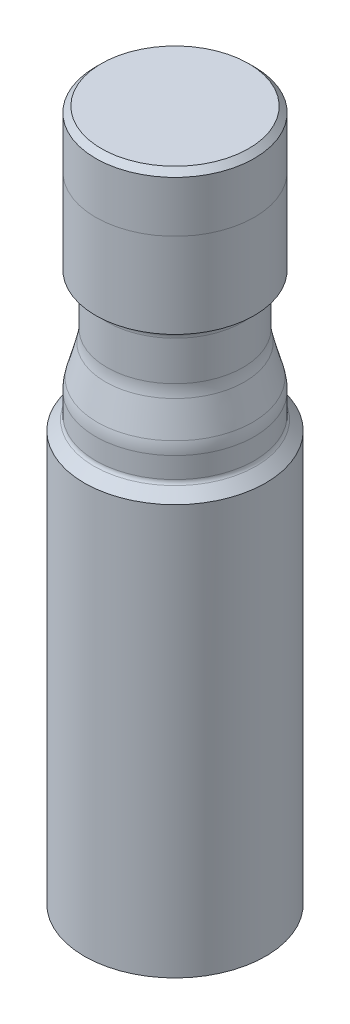
ISO-10303-21;
HEADER;
FILE_DESCRIPTION(('STEP AP214'),'2;1');
FILE_NAME('part.step','',(''),(''),'','','');
FILE_SCHEMA(('AUTOMOTIVE_DESIGN { 1 0 10303 214 1 1 1 1 }'));
ENDSEC;
DATA;
#1=APPLICATION_CONTEXT('core data for automotive mechanical design processes');
#2=APPLICATION_PROTOCOL_DEFINITION('international standard','automotive_design',2000,#1);
#3=PRODUCT_CONTEXT('',#1,'mechanical');
#4=PRODUCT('Part','Part','',(#3));
#5=PRODUCT_RELATED_PRODUCT_CATEGORY('part','',(#4));
#6=PRODUCT_DEFINITION_FORMATION('','',#4);
#7=PRODUCT_DEFINITION_CONTEXT('part definition',#1,'design');
#8=PRODUCT_DEFINITION('design','',#6,#7);
#9=PRODUCT_DEFINITION_SHAPE('','',#8);
#10=(LENGTH_UNIT() NAMED_UNIT(*) SI_UNIT(.MILLI.,.METRE.));
#11=(NAMED_UNIT(*) PLANE_ANGLE_UNIT() SI_UNIT($,.RADIAN.));
#12=(NAMED_UNIT(*) SI_UNIT($,.STERADIAN.) SOLID_ANGLE_UNIT());
#13=UNCERTAINTY_MEASURE_WITH_UNIT(LENGTH_MEASURE(1.E-05),#10,'distance_accuracy_value','');
#14=(GEOMETRIC_REPRESENTATION_CONTEXT(3) GLOBAL_UNCERTAINTY_ASSIGNED_CONTEXT((#13)) GLOBAL_UNIT_ASSIGNED_CONTEXT((#10,
#11,#12)) REPRESENTATION_CONTEXT('',''));
#15=CARTESIAN_POINT('',(0.,0.,0.));
#16=DIRECTION('',(0.,0.,1.));
#17=DIRECTION('',(1.,0.,0.));
#18=AXIS2_PLACEMENT_3D('',#15,#16,#17);
#19=CARTESIAN_POINT('',(180.,669.608554244279,0.));
#20=DIRECTION('',(0.,1.,0.));
#21=DIRECTION('',(0.,0.,1.));
#22=AXIS2_PLACEMENT_3D('',#19,#20,#21);
#23=CYLINDRICAL_SURFACE('',#22,70.);
#24=CARTESIAN_POINT('',(180.,544.608554244279,0.));
#25=DIRECTION('',(0.,1.,0.));
#26=DIRECTION('',(0.,0.,1.));
#27=AXIS2_PLACEMENT_3D('',#24,#25,#26);
#28=CIRCLE('',#27,70.);
#29=CARTESIAN_POINT('',(180.,544.608554244279,70.));
#30=VERTEX_POINT('',#29);
#31=EDGE_CURVE('E87',#30,#30,#28,.T.);
#32=ORIENTED_EDGE('',*,*,#31,.T.);
#33=EDGE_LOOP('',(#32));
#34=FACE_BOUND('',#33,.T.);
#35=CARTESIAN_POINT('',(180.,619.608554244279,0.));
#36=DIRECTION('',(0.,1.,0.));
#37=DIRECTION('',(0.,0.,1.));
#38=AXIS2_PLACEMENT_3D('',#35,#36,#37);
#39=CIRCLE('',#38,70.);
#40=CARTESIAN_POINT('',(180.,619.608554244279,70.));
#41=VERTEX_POINT('',#40);
#42=EDGE_CURVE('E10',#41,#41,#39,.T.);
#43=ORIENTED_EDGE('',*,*,#42,.F.);
#44=EDGE_LOOP('',(#43));
#45=FACE_BOUND('',#44,.T.);
#46=ADVANCED_FACE('F40',(#34,#45),#23,.T.);
#47=CARTESIAN_POINT('',(180.,60.,0.));
#48=DIRECTION('',(0.,1.,0.));
#49=DIRECTION('',(0.,0.,1.));
#50=AXIS2_PLACEMENT_3D('',#47,#48,#49);
#51=PLANE('',#50);
#52=CARTESIAN_POINT('',(180.,59.9999999999999,0.));
#53=DIRECTION('',(0.,1.,0.));
#54=DIRECTION('',(0.,0.,1.));
#55=AXIS2_PLACEMENT_3D('',#52,#53,#54);
#56=CIRCLE('',#55,80.);
#57=CARTESIAN_POINT('',(180.,59.9999999999999,80.));
#58=VERTEX_POINT('',#57);
#59=EDGE_CURVE('E81',#58,#58,#56,.T.);
#60=ORIENTED_EDGE('',*,*,#59,.F.);
#61=EDGE_LOOP('',(#60));
#62=FACE_BOUND('',#61,.T.);
#63=ADVANCED_FACE('F110',(#62),#51,.F.);
#64=CARTESIAN_POINT('',(180.,669.608554244279,0.));
#65=DIRECTION('',(0.,1.,0.));
#66=DIRECTION('',(0.,0.,1.));
#67=AXIS2_PLACEMENT_3D('',#64,#65,#66);
#68=CYLINDRICAL_SURFACE('',#67,80.);
#69=CARTESIAN_POINT('',(180.,421.608554244279,0.));
#70=DIRECTION('',(0.,1.,0.));
#71=DIRECTION('',(0.,0.,1.));
#72=AXIS2_PLACEMENT_3D('',#69,#70,#71);
#73=CIRCLE('',#72,80.);
#74=CARTESIAN_POINT('',(180.,421.608554244279,80.));
#75=VERTEX_POINT('',#74);
#76=EDGE_CURVE('E84',#75,#75,#73,.T.);
#77=ORIENTED_EDGE('',*,*,#76,.F.);
#78=EDGE_LOOP('',(#77));
#79=FACE_BOUND('',#78,.T.);
#80=ORIENTED_EDGE('',*,*,#59,.T.);
#81=EDGE_LOOP('',(#80));
#82=FACE_BOUND('',#81,.T.);
#83=ADVANCED_FACE('F118',(#79,#82),#68,.T.);
#84=CARTESIAN_POINT('',(180.,421.608554244279,0.));
#85=DIRECTION('',(0.,-1.,0.));
#86=DIRECTION('',(0.,0.,-1.));
#87=AXIS2_PLACEMENT_3D('',#84,#85,#86);
#88=CONICAL_SURFACE('',#87,80.,0.785398163397454);
#89=CARTESIAN_POINT('',(180.,430.144088150212,0.));
#90=DIRECTION('',(0.,-1.,0.));
#91=DIRECTION('',(0.,0.,-1.));
#92=AXIS2_PLACEMENT_3D('',#89,#90,#91);
#93=CIRCLE('',#92,71.4644660940673);
#94=CARTESIAN_POINT('',(180.,430.144088150212,-71.4644660940673));
#95=VERTEX_POINT('',#94);
#96=EDGE_CURVE('E48',#95,#95,#93,.T.);
#97=ORIENTED_EDGE('',*,*,#96,.T.);
#98=EDGE_LOOP('',(#97));
#99=FACE_BOUND('',#98,.T.);
#100=ORIENTED_EDGE('',*,*,#76,.T.);
#101=EDGE_LOOP('',(#100));
#102=FACE_BOUND('',#101,.T.);
#103=ADVANCED_FACE('F146',(#99,#102),#88,.T.);
#104=CARTESIAN_POINT('',(180.,669.608554244279,0.));
#105=DIRECTION('',(0.,1.,0.));
#106=DIRECTION('',(0.,0.,1.));
#107=AXIS2_PLACEMENT_3D('',#104,#105,#106);
#108=CYLINDRICAL_SURFACE('',#107,70.);
#109=CARTESIAN_POINT('',(180.,433.679622056145,0.));
#110=DIRECTION('',(0.,1.,0.));
#111=DIRECTION('',(0.,0.,1.));
#112=AXIS2_PLACEMENT_3D('',#109,#110,#111);
#113=CIRCLE('',#112,70.);
#114=CARTESIAN_POINT('',(180.,433.679622056145,70.));
#115=VERTEX_POINT('',#114);
#116=EDGE_CURVE('E54',#115,#115,#113,.T.);
#117=ORIENTED_EDGE('',*,*,#116,.T.);
#118=EDGE_LOOP('',(#117));
#119=FACE_BOUND('',#118,.T.);
#120=CARTESIAN_POINT('',(180.,452.021946265095,0.));
#121=DIRECTION('',(0.,-1.,0.));
#122=DIRECTION('',(0.,0.,-1.));
#123=AXIS2_PLACEMENT_3D('',#120,#121,#122);
#124=CIRCLE('',#123,70.);
#125=CARTESIAN_POINT('',(180.,452.021946265095,-70.));
#126=VERTEX_POINT('',#125);
#127=EDGE_CURVE('E58',#126,#126,#124,.T.);
#128=ORIENTED_EDGE('',*,*,#127,.T.);
#129=EDGE_LOOP('',(#128));
#130=FACE_BOUND('',#129,.T.);
#131=ADVANCED_FACE('F139',(#119,#130),#108,.T.);
#132=CARTESIAN_POINT('',(180.,457.28804616859,0.));
#133=DIRECTION('',(0.,-1.,0.));
#134=DIRECTION('',(0.,0.,-1.));
#135=AXIS2_PLACEMENT_3D('',#132,#133,#134);
#136=CONICAL_SURFACE('',#135,70.,0.26179938779915);
#137=CARTESIAN_POINT('',(180.,489.521892343674,0.));
#138=DIRECTION('',(0.,-1.,0.));
#139=DIRECTION('',(0.,0.,-1.));
#140=AXIS2_PLACEMENT_3D('',#137,#138,#139);
#141=CIRCLE('',#140,61.3629669484373);
#142=CARTESIAN_POINT('',(180.,489.521892343674,-61.3629669484373));
#143=VERTEX_POINT('',#142);
#144=EDGE_CURVE('E63',#143,#143,#141,.T.);
#145=ORIENTED_EDGE('',*,*,#144,.T.);
#146=EDGE_LOOP('',(#145));
#147=FACE_BOUND('',#146,.T.);
#148=CARTESIAN_POINT('',(180.,462.374708069195,0.));
#149=DIRECTION('',(0.,1.,0.));
#150=DIRECTION('',(0.,0.,1.));
#151=AXIS2_PLACEMENT_3D('',#148,#149,#150);
#152=CIRCLE('',#151,68.6370330515627);
#153=CARTESIAN_POINT('',(180.,462.374708069195,68.6370330515627));
#154=VERTEX_POINT('',#153);
#155=EDGE_CURVE('E66',#154,#154,#152,.T.);
#156=ORIENTED_EDGE('',*,*,#155,.T.);
#157=EDGE_LOOP('',(#156));
#158=FACE_BOUND('',#157,.T.);
#159=ADVANCED_FACE('F129',(#147,#158),#136,.T.);
#160=CARTESIAN_POINT('',(180.,669.608554244279,0.));
#161=DIRECTION('',(0.,1.,0.));
#162=DIRECTION('',(0.,0.,1.));
#163=AXIS2_PLACEMENT_3D('',#160,#161,#162);
#164=CYLINDRICAL_SURFACE('',#163,60.);
#165=CARTESIAN_POINT('',(180.,499.874654147775,0.));
#166=DIRECTION('',(0.,1.,0.));
#167=DIRECTION('',(0.,0.,1.));
#168=AXIS2_PLACEMENT_3D('',#165,#166,#167);
#169=CIRCLE('',#168,60.);
#170=CARTESIAN_POINT('',(180.,499.874654147775,60.));
#171=VERTEX_POINT('',#170);
#172=EDGE_CURVE('E69',#171,#171,#169,.T.);
#173=ORIENTED_EDGE('',*,*,#172,.T.);
#174=EDGE_LOOP('',(#173));
#175=FACE_BOUND('',#174,.T.);
#176=CARTESIAN_POINT('',(180.,534.608554244279,0.));
#177=DIRECTION('',(0.,1.,0.));
#178=DIRECTION('',(0.,0.,1.));
#179=AXIS2_PLACEMENT_3D('',#176,#177,#178);
#180=CIRCLE('',#179,60.);
#181=CARTESIAN_POINT('',(180.,534.608554244279,60.));
#182=VERTEX_POINT('',#181);
#183=EDGE_CURVE('E72',#182,#182,#180,.F.);
#184=ORIENTED_EDGE('',*,*,#183,.T.);
#185=EDGE_LOOP('',(#184));
#186=FACE_BOUND('',#185,.T.);
#187=ADVANCED_FACE('F124',(#175,#186),#164,.T.);
#188=ORIENTED_EDGE('',*,*,#42,.T.);
#189=EDGE_LOOP('',(#188));
#190=FACE_BOUND('',#189,.T.);
#191=CARTESIAN_POINT('',(180.,664.608554244279,0.));
#192=DIRECTION('',(0.,-1.,0.));
#193=DIRECTION('',(0.,0.,-1.));
#194=AXIS2_PLACEMENT_3D('',#191,#192,#193);
#195=CIRCLE('',#194,70.);
#196=CARTESIAN_POINT('',(180.,664.608554244279,-70.));
#197=VERTEX_POINT('',#196);
#198=EDGE_CURVE('E75',#197,#197,#195,.T.);
#199=ORIENTED_EDGE('',*,*,#198,.T.);
#200=EDGE_LOOP('',(#199));
#201=FACE_BOUND('',#200,.T.);
#202=ADVANCED_FACE('F112',(#190,#201),#23,.T.);
#203=CARTESIAN_POINT('',(250.,669.608554244279,0.));
#204=DIRECTION('',(0.,-1.,0.));
#205=DIRECTION('',(0.,0.,-1.));
#206=AXIS2_PLACEMENT_3D('',#203,#204,#205);
#207=PLANE('',#206);
#208=CARTESIAN_POINT('',(180.,669.608554244279,0.));
#209=DIRECTION('',(0.,-1.,0.));
#210=DIRECTION('',(0.,0.,-1.));
#211=AXIS2_PLACEMENT_3D('',#208,#209,#210);
#212=CIRCLE('',#211,65.0000000000001);
#213=CARTESIAN_POINT('',(180.,669.608554244279,-65.0000000000001));
#214=VERTEX_POINT('',#213);
#215=EDGE_CURVE('E78',#214,#214,#212,.F.);
#216=ORIENTED_EDGE('',*,*,#215,.T.);
#217=EDGE_LOOP('',(#216));
#218=FACE_BOUND('',#217,.T.);
#219=ADVANCED_FACE('F105',(#218),#207,.F.);
#220=CARTESIAN_POINT('',(180.,669.608554244279,0.));
#221=DIRECTION('',(0.,-1.,0.));
#222=DIRECTION('',(0.,0.,-1.));
#223=AXIS2_PLACEMENT_3D('',#220,#221,#222);
#224=CONICAL_SURFACE('',#223,65.0000000000001,0.785398163397443);
#225=ORIENTED_EDGE('',*,*,#198,.F.);
#226=EDGE_LOOP('',(#225));
#227=FACE_BOUND('',#226,.T.);
#228=ORIENTED_EDGE('',*,*,#215,.F.);
#229=EDGE_LOOP('',(#228));
#230=FACE_BOUND('',#229,.T.);
#231=ADVANCED_FACE('F96',(#227,#230),#224,.T.);
#232=CARTESIAN_POINT('',(180.,534.608554244279,0.));
#233=DIRECTION('',(0.,1.,0.));
#234=DIRECTION('',(0.,0.,1.));
#235=AXIS2_PLACEMENT_3D('',#232,#233,#234);
#236=TOROIDAL_SURFACE('',#235,70.,10.);
#237=ORIENTED_EDGE('',*,*,#183,.F.);
#238=EDGE_LOOP('',(#237));
#239=FACE_BOUND('',#238,.T.);
#240=ORIENTED_EDGE('',*,*,#31,.F.);
#241=EDGE_LOOP('',(#240));
#242=FACE_BOUND('',#241,.T.);
#243=ADVANCED_FACE('F93',(#239,#242),#236,.F.);
#244=CARTESIAN_POINT('',(180.,499.874654147775,0.));
#245=DIRECTION('',(0.,1.,0.));
#246=DIRECTION('',(0.,0.,1.));
#247=AXIS2_PLACEMENT_3D('',#244,#245,#246);
#248=TOROIDAL_SURFACE('',#247,100.,40.);
#249=ORIENTED_EDGE('',*,*,#144,.F.);
#250=EDGE_LOOP('',(#249));
#251=FACE_BOUND('',#250,.T.);
#252=ORIENTED_EDGE('',*,*,#172,.F.);
#253=EDGE_LOOP('',(#252));
#254=FACE_BOUND('',#253,.T.);
#255=ADVANCED_FACE('F95',(#251,#254),#248,.F.);
#256=CARTESIAN_POINT('',(180.,452.021946265095,0.));
#257=DIRECTION('',(0.,-1.,0.));
#258=DIRECTION('',(0.,0.,-1.));
#259=AXIS2_PLACEMENT_3D('',#256,#257,#258);
#260=DEGENERATE_TOROIDAL_SURFACE('',#259,30.,40.,.T.);
#261=ORIENTED_EDGE('',*,*,#127,.F.);
#262=EDGE_LOOP('',(#261));
#263=FACE_BOUND('',#262,.T.);
#264=ORIENTED_EDGE('',*,*,#155,.F.);
#265=EDGE_LOOP('',(#264));
#266=FACE_BOUND('',#265,.T.);
#267=ADVANCED_FACE('F101',(#263,#266),#260,.T.);
#268=CARTESIAN_POINT('',(180.,433.679622056145,0.));
#269=DIRECTION('',(0.,1.,0.));
#270=DIRECTION('',(0.,0.,1.));
#271=AXIS2_PLACEMENT_3D('',#268,#269,#270);
#272=TOROIDAL_SURFACE('',#271,75.,5.);
#273=ORIENTED_EDGE('',*,*,#96,.F.);
#274=EDGE_LOOP('',(#273));
#275=FACE_BOUND('',#274,.T.);
#276=ORIENTED_EDGE('',*,*,#116,.F.);
#277=EDGE_LOOP('',(#276));
#278=FACE_BOUND('',#277,.T.);
#279=ADVANCED_FACE('F42',(#275,#278),#272,.F.);
#280=CLOSED_SHELL('',(#46,#63,#83,#103,#131,#159,#187,#202,#219,#231,#243,#255,#267,#279));
#281=MANIFOLD_SOLID_BREP('B2',#280);
#282=ADVANCED_BREP_SHAPE_REPRESENTATION('',(#18,#281),#14);
#283=SHAPE_DEFINITION_REPRESENTATION(#9,#282);
ENDSEC;
END-ISO-10303-21;
